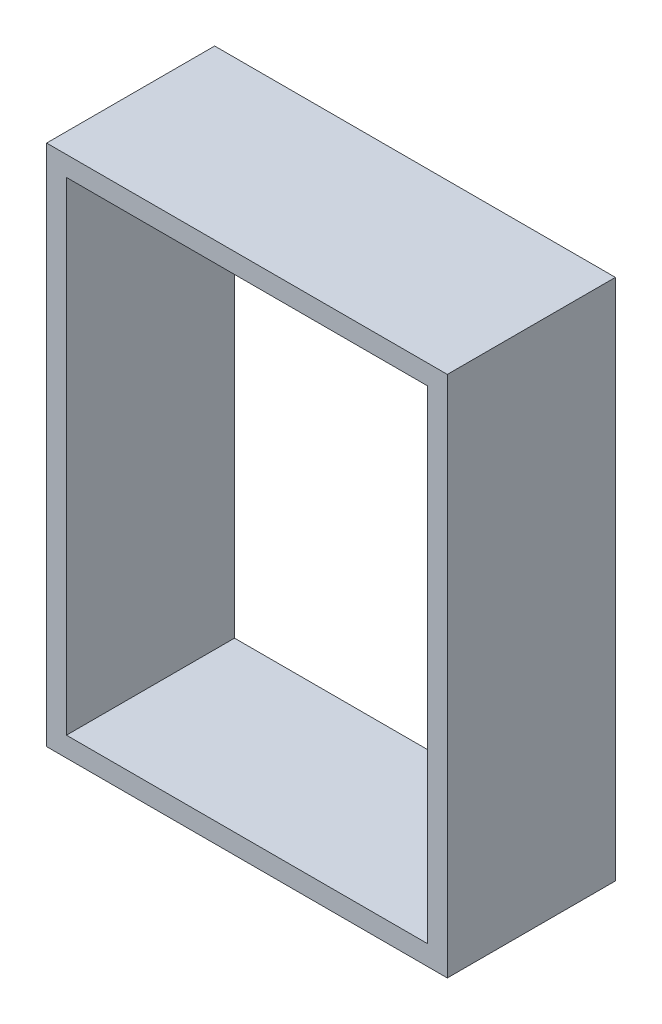
ISO-10303-21;
HEADER;
FILE_DESCRIPTION(('STEP AP214'),'2;1');
FILE_NAME('part.step','',(''),(''),'','','');
FILE_SCHEMA(('AUTOMOTIVE_DESIGN { 1 0 10303 214 1 1 1 1 }'));
ENDSEC;
DATA;
#1=APPLICATION_CONTEXT('core data for automotive mechanical design processes');
#2=APPLICATION_PROTOCOL_DEFINITION('international standard','automotive_design',2000,#1);
#3=PRODUCT_CONTEXT('',#1,'mechanical');
#4=PRODUCT('Part','Part','',(#3));
#5=PRODUCT_RELATED_PRODUCT_CATEGORY('part','',(#4));
#6=PRODUCT_DEFINITION_FORMATION('','',#4);
#7=PRODUCT_DEFINITION_CONTEXT('part definition',#1,'design');
#8=PRODUCT_DEFINITION('design','',#6,#7);
#9=PRODUCT_DEFINITION_SHAPE('','',#8);
#10=(LENGTH_UNIT() NAMED_UNIT(*) SI_UNIT(.MILLI.,.METRE.));
#11=(NAMED_UNIT(*) PLANE_ANGLE_UNIT() SI_UNIT($,.RADIAN.));
#12=(NAMED_UNIT(*) SI_UNIT($,.STERADIAN.) SOLID_ANGLE_UNIT());
#13=UNCERTAINTY_MEASURE_WITH_UNIT(LENGTH_MEASURE(1.E-05),#10,'distance_accuracy_value','');
#14=(GEOMETRIC_REPRESENTATION_CONTEXT(3) GLOBAL_UNCERTAINTY_ASSIGNED_CONTEXT((#13)) GLOBAL_UNIT_ASSIGNED_CONTEXT((#10,
#11,#12)) REPRESENTATION_CONTEXT('',''));
#15=CARTESIAN_POINT('',(0.,0.,0.));
#16=DIRECTION('',(0.,0.,1.));
#17=DIRECTION('',(1.,0.,0.));
#18=AXIS2_PLACEMENT_3D('',#15,#16,#17);
#19=CARTESIAN_POINT('',(0.,0.,6.35));
#20=DIRECTION('',(0.,0.,1.));
#21=DIRECTION('',(1.,0.,0.));
#22=AXIS2_PLACEMENT_3D('',#19,#20,#21);
#23=PLANE('',#22);
#24=DIRECTION('',(0.,-1.,0.));
#25=VECTOR('',#24,1.);
#26=CARTESIAN_POINT('',(-25.55,44.75,6.35));
#27=LINE('',#26,#25);
#28=CARTESIAN_POINT('',(-25.55,44.75,6.35));
#29=VERTEX_POINT('',#28);
#30=CARTESIAN_POINT('',(-25.55,5.25,6.35));
#31=VERTEX_POINT('',#30);
#32=EDGE_CURVE('E145',#29,#31,#27,.T.);
#33=ORIENTED_EDGE('',*,*,#32,.T.);
#34=DIRECTION('',(1.,0.,0.));
#35=VECTOR('',#34,1.);
#36=CARTESIAN_POINT('',(-25.55,5.25,6.35));
#37=LINE('',#36,#35);
#38=CARTESIAN_POINT('',(4.73,5.25,6.35));
#39=VERTEX_POINT('',#38);
#40=EDGE_CURVE('E144',#31,#39,#37,.T.);
#41=ORIENTED_EDGE('',*,*,#40,.T.);
#42=DIRECTION('',(0.,1.,0.));
#43=VECTOR('',#42,1.);
#44=CARTESIAN_POINT('',(4.73,5.25,6.35));
#45=LINE('',#44,#43);
#46=CARTESIAN_POINT('',(4.73,44.75,6.35));
#47=VERTEX_POINT('',#46);
#48=EDGE_CURVE('E149',#39,#47,#45,.T.);
#49=ORIENTED_EDGE('',*,*,#48,.T.);
#50=DIRECTION('',(-1.,0.,0.));
#51=VECTOR('',#50,1.);
#52=CARTESIAN_POINT('',(4.73,44.75,6.35));
#53=LINE('',#52,#51);
#54=EDGE_CURVE('E148',#47,#29,#53,.T.);
#55=ORIENTED_EDGE('',*,*,#54,.T.);
#56=EDGE_LOOP('',(#33,#41,#49,#55));
#57=FACE_BOUND('',#56,.T.);
#58=DIRECTION('',(1.,0.,0.));
#59=VECTOR('',#58,1.);
#60=CARTESIAN_POINT('',(-24.05,6.75,6.35));
#61=LINE('',#60,#59);
#62=CARTESIAN_POINT('',(-24.05,6.75,6.35));
#63=VERTEX_POINT('',#62);
#64=CARTESIAN_POINT('',(3.23,6.75,6.35));
#65=VERTEX_POINT('',#64);
#66=EDGE_CURVE('E114',#63,#65,#61,.T.);
#67=ORIENTED_EDGE('',*,*,#66,.F.);
#68=DIRECTION('',(0.,-1.,0.));
#69=VECTOR('',#68,1.);
#70=CARTESIAN_POINT('',(-24.05,43.25,6.35));
#71=LINE('',#70,#69);
#72=CARTESIAN_POINT('',(-24.05,43.25,6.35));
#73=VERTEX_POINT('',#72);
#74=EDGE_CURVE('E107',#73,#63,#71,.T.);
#75=ORIENTED_EDGE('',*,*,#74,.F.);
#76=DIRECTION('',(-1.,0.,0.));
#77=VECTOR('',#76,1.);
#78=CARTESIAN_POINT('',(3.23,43.25,6.35));
#79=LINE('',#78,#77);
#80=CARTESIAN_POINT('',(3.23,43.25,6.35));
#81=VERTEX_POINT('',#80);
#82=EDGE_CURVE('E126',#81,#73,#79,.T.);
#83=ORIENTED_EDGE('',*,*,#82,.F.);
#84=DIRECTION('',(0.,1.,0.));
#85=VECTOR('',#84,1.);
#86=CARTESIAN_POINT('',(3.23,6.75,6.35));
#87=LINE('',#86,#85);
#88=EDGE_CURVE('E128',#65,#81,#87,.T.);
#89=ORIENTED_EDGE('',*,*,#88,.F.);
#90=EDGE_LOOP('',(#67,#75,#83,#89));
#91=FACE_BOUND('',#90,.T.);
#92=ADVANCED_FACE('F41',(#57,#91),#23,.T.);
#93=CARTESIAN_POINT('',(0.,0.,-6.35));
#94=DIRECTION('',(0.,0.,1.));
#95=DIRECTION('',(1.,0.,0.));
#96=AXIS2_PLACEMENT_3D('',#93,#94,#95);
#97=PLANE('',#96);
#98=DIRECTION('',(0.,-1.,0.));
#99=VECTOR('',#98,1.);
#100=CARTESIAN_POINT('',(-25.55,44.75,-6.35));
#101=LINE('',#100,#99);
#102=CARTESIAN_POINT('',(-25.55,44.75,-6.35));
#103=VERTEX_POINT('',#102);
#104=CARTESIAN_POINT('',(-25.55,5.25,-6.35));
#105=VERTEX_POINT('',#104);
#106=EDGE_CURVE('E122',#103,#105,#101,.T.);
#107=ORIENTED_EDGE('',*,*,#106,.F.);
#108=DIRECTION('',(-1.,0.,0.));
#109=VECTOR('',#108,1.);
#110=CARTESIAN_POINT('',(4.73,44.75,-6.35));
#111=LINE('',#110,#109);
#112=CARTESIAN_POINT('',(4.73,44.75,-6.35));
#113=VERTEX_POINT('',#112);
#114=EDGE_CURVE('E147',#113,#103,#111,.T.);
#115=ORIENTED_EDGE('',*,*,#114,.F.);
#116=DIRECTION('',(0.,1.,0.));
#117=VECTOR('',#116,1.);
#118=CARTESIAN_POINT('',(4.73,5.25,-6.35));
#119=LINE('',#118,#117);
#120=CARTESIAN_POINT('',(4.73,5.25,-6.35));
#121=VERTEX_POINT('',#120);
#122=EDGE_CURVE('E160',#121,#113,#119,.T.);
#123=ORIENTED_EDGE('',*,*,#122,.F.);
#124=DIRECTION('',(1.,0.,0.));
#125=VECTOR('',#124,1.);
#126=CARTESIAN_POINT('',(-25.55,5.25,-6.35));
#127=LINE('',#126,#125);
#128=EDGE_CURVE('E151',#105,#121,#127,.T.);
#129=ORIENTED_EDGE('',*,*,#128,.F.);
#130=EDGE_LOOP('',(#107,#115,#123,#129));
#131=FACE_BOUND('',#130,.T.);
#132=DIRECTION('',(0.,-1.,0.));
#133=VECTOR('',#132,1.);
#134=CARTESIAN_POINT('',(-24.05,43.25,-6.35));
#135=LINE('',#134,#133);
#136=CARTESIAN_POINT('',(-24.05,43.25,-6.35));
#137=VERTEX_POINT('',#136);
#138=CARTESIAN_POINT('',(-24.05,6.75,-6.35));
#139=VERTEX_POINT('',#138);
#140=EDGE_CURVE('E64',#137,#139,#135,.T.);
#141=ORIENTED_EDGE('',*,*,#140,.T.);
#142=DIRECTION('',(1.,0.,0.));
#143=VECTOR('',#142,1.);
#144=CARTESIAN_POINT('',(-24.05,6.75,-6.35));
#145=LINE('',#144,#143);
#146=CARTESIAN_POINT('',(3.23,6.75,-6.35));
#147=VERTEX_POINT('',#146);
#148=EDGE_CURVE('E123',#139,#147,#145,.T.);
#149=ORIENTED_EDGE('',*,*,#148,.T.);
#150=DIRECTION('',(0.,1.,0.));
#151=VECTOR('',#150,1.);
#152=CARTESIAN_POINT('',(3.23,6.75,-6.35));
#153=LINE('',#152,#151);
#154=CARTESIAN_POINT('',(3.23,43.25,-6.35));
#155=VERTEX_POINT('',#154);
#156=EDGE_CURVE('E132',#147,#155,#153,.T.);
#157=ORIENTED_EDGE('',*,*,#156,.T.);
#158=DIRECTION('',(-1.,0.,0.));
#159=VECTOR('',#158,1.);
#160=CARTESIAN_POINT('',(3.23,43.25,-6.35));
#161=LINE('',#160,#159);
#162=EDGE_CURVE('E113',#155,#137,#161,.T.);
#163=ORIENTED_EDGE('',*,*,#162,.T.);
#164=EDGE_LOOP('',(#141,#149,#157,#163));
#165=FACE_BOUND('',#164,.T.);
#166=ADVANCED_FACE('F172',(#131,#165),#97,.F.);
#167=CARTESIAN_POINT('',(-25.55,44.75,6.35));
#168=DIRECTION('',(1.,0.,0.));
#169=DIRECTION('',(0.,0.,-1.));
#170=AXIS2_PLACEMENT_3D('',#167,#168,#169);
#171=PLANE('',#170);
#172=ORIENTED_EDGE('',*,*,#106,.T.);
#173=DIRECTION('',(0.,0.,-1.));
#174=VECTOR('',#173,1.);
#175=CARTESIAN_POINT('',(-25.55,5.25,6.35));
#176=LINE('',#175,#174);
#177=EDGE_CURVE('E11',#31,#105,#176,.T.);
#178=ORIENTED_EDGE('',*,*,#177,.F.);
#179=ORIENTED_EDGE('',*,*,#32,.F.);
#180=DIRECTION('',(0.,0.,-1.));
#181=VECTOR('',#180,1.);
#182=CARTESIAN_POINT('',(-25.55,44.75,6.35));
#183=LINE('',#182,#181);
#184=EDGE_CURVE('E155',#29,#103,#183,.T.);
#185=ORIENTED_EDGE('',*,*,#184,.T.);
#186=EDGE_LOOP('',(#172,#178,#179,#185));
#187=FACE_BOUND('',#186,.T.);
#188=ADVANCED_FACE('F43',(#187),#171,.F.);
#189=CARTESIAN_POINT('',(-25.55,5.25,6.35));
#190=DIRECTION('',(0.,1.,0.));
#191=DIRECTION('',(0.,0.,1.));
#192=AXIS2_PLACEMENT_3D('',#189,#190,#191);
#193=PLANE('',#192);
#194=ORIENTED_EDGE('',*,*,#128,.T.);
#195=DIRECTION('',(0.,0.,-1.));
#196=VECTOR('',#195,1.);
#197=CARTESIAN_POINT('',(4.73,5.25,6.35));
#198=LINE('',#197,#196);
#199=EDGE_CURVE('E47',#39,#121,#198,.T.);
#200=ORIENTED_EDGE('',*,*,#199,.F.);
#201=ORIENTED_EDGE('',*,*,#40,.F.);
#202=ORIENTED_EDGE('',*,*,#177,.T.);
#203=EDGE_LOOP('',(#194,#200,#201,#202));
#204=FACE_BOUND('',#203,.T.);
#205=ADVANCED_FACE('F184',(#204),#193,.F.);
#206=CARTESIAN_POINT('',(4.73,5.25,6.35));
#207=DIRECTION('',(-1.,0.,0.));
#208=DIRECTION('',(0.,0.,1.));
#209=AXIS2_PLACEMENT_3D('',#206,#207,#208);
#210=PLANE('',#209);
#211=ORIENTED_EDGE('',*,*,#122,.T.);
#212=DIRECTION('',(0.,0.,-1.));
#213=VECTOR('',#212,1.);
#214=CARTESIAN_POINT('',(4.73,44.75,6.35));
#215=LINE('',#214,#213);
#216=EDGE_CURVE('E165',#47,#113,#215,.T.);
#217=ORIENTED_EDGE('',*,*,#216,.F.);
#218=ORIENTED_EDGE('',*,*,#48,.F.);
#219=ORIENTED_EDGE('',*,*,#199,.T.);
#220=EDGE_LOOP('',(#211,#217,#218,#219));
#221=FACE_BOUND('',#220,.T.);
#222=ADVANCED_FACE('F170',(#221),#210,.F.);
#223=CARTESIAN_POINT('',(4.73,44.75,6.35));
#224=DIRECTION('',(0.,-1.,0.));
#225=DIRECTION('',(0.,0.,-1.));
#226=AXIS2_PLACEMENT_3D('',#223,#224,#225);
#227=PLANE('',#226);
#228=ORIENTED_EDGE('',*,*,#114,.T.);
#229=ORIENTED_EDGE('',*,*,#184,.F.);
#230=ORIENTED_EDGE('',*,*,#54,.F.);
#231=ORIENTED_EDGE('',*,*,#216,.T.);
#232=EDGE_LOOP('',(#228,#229,#230,#231));
#233=FACE_BOUND('',#232,.T.);
#234=ADVANCED_FACE('F177',(#233),#227,.F.);
#235=CARTESIAN_POINT('',(-24.05,43.25,6.35));
#236=DIRECTION('',(1.,0.,0.));
#237=DIRECTION('',(0.,0.,-1.));
#238=AXIS2_PLACEMENT_3D('',#235,#236,#237);
#239=PLANE('',#238);
#240=ORIENTED_EDGE('',*,*,#140,.F.);
#241=DIRECTION('',(0.,0.,-1.));
#242=VECTOR('',#241,1.);
#243=CARTESIAN_POINT('',(-24.05,43.25,6.35));
#244=LINE('',#243,#242);
#245=EDGE_CURVE('E106',#73,#137,#244,.T.);
#246=ORIENTED_EDGE('',*,*,#245,.F.);
#247=ORIENTED_EDGE('',*,*,#74,.T.);
#248=DIRECTION('',(0.,0.,-1.));
#249=VECTOR('',#248,1.);
#250=CARTESIAN_POINT('',(-24.05,6.75,6.35));
#251=LINE('',#250,#249);
#252=EDGE_CURVE('E109',#63,#139,#251,.T.);
#253=ORIENTED_EDGE('',*,*,#252,.T.);
#254=EDGE_LOOP('',(#240,#246,#247,#253));
#255=FACE_BOUND('',#254,.T.);
#256=ADVANCED_FACE('F108',(#255),#239,.T.);
#257=CARTESIAN_POINT('',(-24.05,6.75,6.35));
#258=DIRECTION('',(0.,1.,0.));
#259=DIRECTION('',(0.,0.,1.));
#260=AXIS2_PLACEMENT_3D('',#257,#258,#259);
#261=PLANE('',#260);
#262=ORIENTED_EDGE('',*,*,#148,.F.);
#263=ORIENTED_EDGE('',*,*,#252,.F.);
#264=ORIENTED_EDGE('',*,*,#66,.T.);
#265=DIRECTION('',(0.,0.,-1.));
#266=VECTOR('',#265,1.);
#267=CARTESIAN_POINT('',(3.23,6.75,6.35));
#268=LINE('',#267,#266);
#269=EDGE_CURVE('E121',#65,#147,#268,.T.);
#270=ORIENTED_EDGE('',*,*,#269,.T.);
#271=EDGE_LOOP('',(#262,#263,#264,#270));
#272=FACE_BOUND('',#271,.T.);
#273=ADVANCED_FACE('F118',(#272),#261,.T.);
#274=CARTESIAN_POINT('',(3.23,6.75,6.35));
#275=DIRECTION('',(-1.,0.,0.));
#276=DIRECTION('',(0.,0.,1.));
#277=AXIS2_PLACEMENT_3D('',#274,#275,#276);
#278=PLANE('',#277);
#279=ORIENTED_EDGE('',*,*,#156,.F.);
#280=ORIENTED_EDGE('',*,*,#269,.F.);
#281=ORIENTED_EDGE('',*,*,#88,.T.);
#282=DIRECTION('',(0.,0.,-1.));
#283=VECTOR('',#282,1.);
#284=CARTESIAN_POINT('',(3.23,43.25,6.35));
#285=LINE('',#284,#283);
#286=EDGE_CURVE('E57',#81,#155,#285,.T.);
#287=ORIENTED_EDGE('',*,*,#286,.T.);
#288=EDGE_LOOP('',(#279,#280,#281,#287));
#289=FACE_BOUND('',#288,.T.);
#290=ADVANCED_FACE('F208',(#289),#278,.T.);
#291=CARTESIAN_POINT('',(3.23,43.25,6.35));
#292=DIRECTION('',(0.,-1.,0.));
#293=DIRECTION('',(0.,0.,-1.));
#294=AXIS2_PLACEMENT_3D('',#291,#292,#293);
#295=PLANE('',#294);
#296=ORIENTED_EDGE('',*,*,#162,.F.);
#297=ORIENTED_EDGE('',*,*,#286,.F.);
#298=ORIENTED_EDGE('',*,*,#82,.T.);
#299=ORIENTED_EDGE('',*,*,#245,.T.);
#300=EDGE_LOOP('',(#296,#297,#298,#299));
#301=FACE_BOUND('',#300,.T.);
#302=ADVANCED_FACE('F212',(#301),#295,.T.);
#303=CLOSED_SHELL('',(#92,#166,#188,#205,#222,#234,#256,#273,#290,#302));
#304=MANIFOLD_SOLID_BREP('B2',#303);
#305=ADVANCED_BREP_SHAPE_REPRESENTATION('',(#18,#304),#14);
#306=SHAPE_DEFINITION_REPRESENTATION(#9,#305);
ENDSEC;
END-ISO-10303-21;
